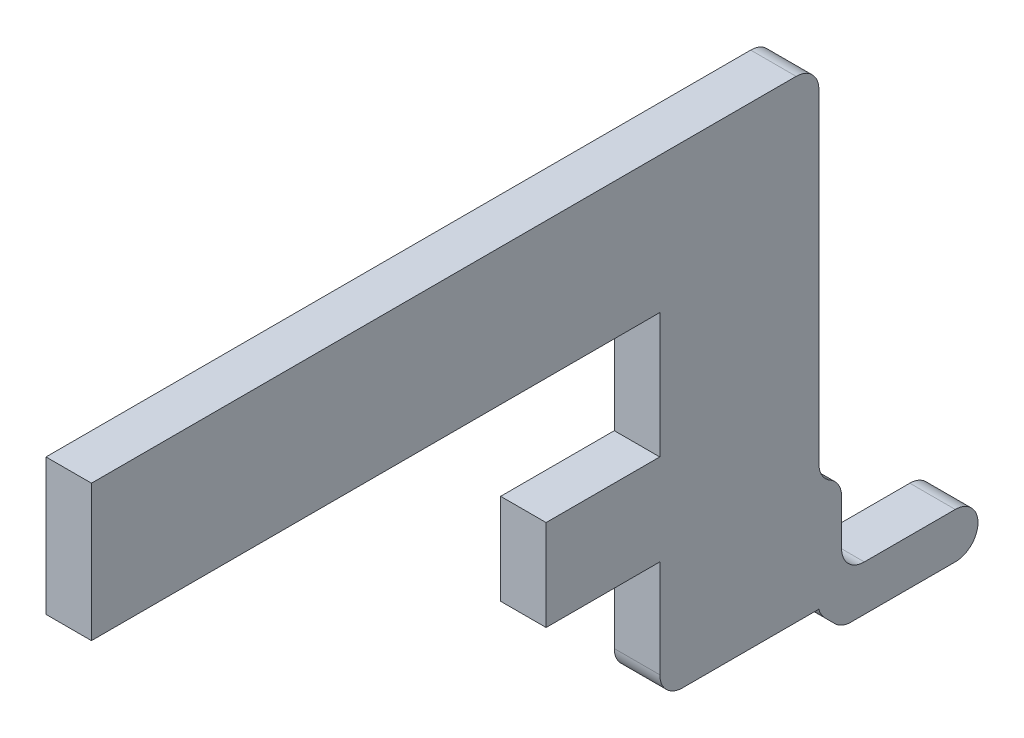
ISO-10303-21;
HEADER;
FILE_DESCRIPTION(('STEP AP214'),'2;1');
FILE_NAME('part.step','',(''),(''),'','','');
FILE_SCHEMA(('AUTOMOTIVE_DESIGN { 1 0 10303 214 1 1 1 1 }'));
ENDSEC;
DATA;
#1=APPLICATION_CONTEXT('core data for automotive mechanical design processes');
#2=APPLICATION_PROTOCOL_DEFINITION('international standard','automotive_design',2000,#1);
#3=PRODUCT_CONTEXT('',#1,'mechanical');
#4=PRODUCT('Part','Part','',(#3));
#5=PRODUCT_RELATED_PRODUCT_CATEGORY('part','',(#4));
#6=PRODUCT_DEFINITION_FORMATION('','',#4);
#7=PRODUCT_DEFINITION_CONTEXT('part definition',#1,'design');
#8=PRODUCT_DEFINITION('design','',#6,#7);
#9=PRODUCT_DEFINITION_SHAPE('','',#8);
#10=(LENGTH_UNIT() NAMED_UNIT(*) SI_UNIT(.MILLI.,.METRE.));
#11=(NAMED_UNIT(*) PLANE_ANGLE_UNIT() SI_UNIT($,.RADIAN.));
#12=(NAMED_UNIT(*) SI_UNIT($,.STERADIAN.) SOLID_ANGLE_UNIT());
#13=UNCERTAINTY_MEASURE_WITH_UNIT(LENGTH_MEASURE(1.E-05),#10,'distance_accuracy_value','');
#14=(GEOMETRIC_REPRESENTATION_CONTEXT(3) GLOBAL_UNCERTAINTY_ASSIGNED_CONTEXT((#13)) GLOBAL_UNIT_ASSIGNED_CONTEXT((#10,
#11,#12)) REPRESENTATION_CONTEXT('',''));
#15=CARTESIAN_POINT('',(0.,0.,0.));
#16=DIRECTION('',(0.,0.,1.));
#17=DIRECTION('',(1.,0.,0.));
#18=AXIS2_PLACEMENT_3D('',#15,#16,#17);
#19=CARTESIAN_POINT('',(2.6,-0.044,-5.038));
#20=DIRECTION('',(-1.,0.,0.));
#21=DIRECTION('',(0.,0.,1.));
#22=AXIS2_PLACEMENT_3D('',#19,#20,#21);
#23=PLANE('',#22);
#24=DIRECTION('',(0.,0.,-1.));
#25=VECTOR('',#24,1.);
#26=CARTESIAN_POINT('',(2.6,1.6,-3.61));
#27=LINE('',#26,#25);
#28=CARTESIAN_POINT('',(2.6,1.6,-3.56));
#29=VERTEX_POINT('',#28);
#30=CARTESIAN_POINT('',(2.6,1.6,-1.06));
#31=VERTEX_POINT('',#30);
#32=EDGE_CURVE('E205',#29,#31,#27,.F.);
#33=ORIENTED_EDGE('',*,*,#32,.F.);
#34=DIRECTION('',(0.,1.,0.));
#35=VECTOR('',#34,1.);
#36=CARTESIAN_POINT('',(2.6,1.039,-3.56));
#37=LINE('',#36,#35);
#38=CARTESIAN_POINT('',(2.6,1.05,-3.56));
#39=VERTEX_POINT('',#38);
#40=EDGE_CURVE('E220',#39,#29,#37,.T.);
#41=ORIENTED_EDGE('',*,*,#40,.F.);
#42=DIRECTION('',(0.,0.,1.));
#43=VECTOR('',#42,1.);
#44=CARTESIAN_POINT('',(2.6,1.05,-3.05));
#45=LINE('',#44,#43);
#46=CARTESIAN_POINT('',(2.6,1.05,-3.06));
#47=VERTEX_POINT('',#46);
#48=EDGE_CURVE('E234',#47,#39,#45,.F.);
#49=ORIENTED_EDGE('',*,*,#48,.F.);
#50=DIRECTION('',(0.,1.,0.));
#51=VECTOR('',#50,1.);
#52=CARTESIAN_POINT('',(2.6,0.642,-3.06));
#53=LINE('',#52,#51);
#54=CARTESIAN_POINT('',(2.6,0.65,-3.06));
#55=VERTEX_POINT('',#54);
#56=EDGE_CURVE('E248',#55,#47,#53,.T.);
#57=ORIENTED_EDGE('',*,*,#56,.F.);
#58=DIRECTION('',(0.,0.,-1.));
#59=VECTOR('',#58,1.);
#60=CARTESIAN_POINT('',(2.6,0.65,-3.57));
#61=LINE('',#60,#59);
#62=CARTESIAN_POINT('',(2.6,0.65,-3.56));
#63=VERTEX_POINT('',#62);
#64=EDGE_CURVE('E262',#63,#55,#61,.F.);
#65=ORIENTED_EDGE('',*,*,#64,.F.);
#66=DIRECTION('',(0.,1.,0.));
#67=VECTOR('',#66,1.);
#68=CARTESIAN_POINT('',(2.6,0.2114,-3.56));
#69=LINE('',#68,#67);
#70=CARTESIAN_POINT('',(2.6,0.22,-3.56));
#71=VERTEX_POINT('',#70);
#72=EDGE_CURVE('E269',#71,#63,#69,.T.);
#73=ORIENTED_EDGE('',*,*,#72,.F.);
#74=CARTESIAN_POINT('',(2.6,0.22,-3.66));
#75=DIRECTION('',(1.,0.,0.));
#76=DIRECTION('',(0.,0.,-1.));
#77=AXIS2_PLACEMENT_3D('',#74,#75,#76);
#78=CIRCLE('',#77,0.1);
#79=CARTESIAN_POINT('',(2.6,0.12,-3.66));
#80=VERTEX_POINT('',#79);
#81=EDGE_CURVE('E328',#80,#71,#78,.F.);
#82=ORIENTED_EDGE('',*,*,#81,.F.);
#83=DIRECTION('',(0.,0.,1.));
#84=VECTOR('',#83,1.);
#85=CARTESIAN_POINT('',(2.6,0.12,-3.648));
#86=LINE('',#85,#84);
#87=CARTESIAN_POINT('',(2.6,0.12,-4.26000000000019));
#88=VERTEX_POINT('',#87);
#89=EDGE_CURVE('E274',#80,#88,#86,.F.);
#90=ORIENTED_EDGE('',*,*,#89,.T.);
#91=CARTESIAN_POINT('',(2.6,0.14445859456,-4.356962761678));
#92=DIRECTION('',(1.,0.,0.));
#93=DIRECTION('',(0.,0.,-1.));
#94=AXIS2_PLACEMENT_3D('',#91,#92,#93);
#95=CIRCLE('',#94,0.1);
#96=CARTESIAN_POINT('',(2.6,0.0737479164409623,-4.28625208355938));
#97=VERTEX_POINT('',#96);
#98=EDGE_CURVE('E277',#97,#88,#95,.F.);
#99=ORIENTED_EDGE('',*,*,#98,.F.);
#100=DIRECTION('',(0.,-0.707106781184048,-0.707106781189048));
#101=VECTOR('',#100,1.);
#102=CARTESIAN_POINT('',(2.6,0.02548606012333,-4.334513939877));
#103=LINE('',#102,#101);
#104=CARTESIAN_POINT('',(2.6,0.0292893218813691,-4.33071067811893));
#105=VERTEX_POINT('',#104);
#106=EDGE_CURVE('E278',#105,#97,#103,.F.);
#107=ORIENTED_EDGE('',*,*,#106,.F.);
#108=CARTESIAN_POINT('',(2.6,0.1,-4.401421356237));
#109=DIRECTION('',(-1.,0.,0.));
#110=DIRECTION('',(0.,0.,1.));
#111=AXIS2_PLACEMENT_3D('',#108,#109,#110);
#112=CIRCLE('',#111,0.1);
#113=CARTESIAN_POINT('',(2.6,0.,-4.401421356237));
#114=VERTEX_POINT('',#113);
#115=EDGE_CURVE('E285',#114,#105,#112,.T.);
#116=ORIENTED_EDGE('',*,*,#115,.F.);
#117=DIRECTION('',(0.,0.,-1.));
#118=VECTOR('',#117,1.);
#119=CARTESIAN_POINT('',(2.6,0.,-4.869171572875));
#120=LINE('',#119,#118);
#121=CARTESIAN_POINT('',(2.6,0.,-4.86));
#122=VERTEX_POINT('',#121);
#123=EDGE_CURVE('E282',#122,#114,#120,.F.);
#124=ORIENTED_EDGE('',*,*,#123,.F.);
#125=CARTESIAN_POINT('',(2.6,0.1,-4.86));
#126=DIRECTION('',(1.,0.,0.));
#127=DIRECTION('',(0.,0.,-1.));
#128=AXIS2_PLACEMENT_3D('',#125,#126,#127);
#129=CIRCLE('',#128,0.1);
#130=CARTESIAN_POINT('',(2.6,0.2,-4.86));
#131=VERTEX_POINT('',#130);
#132=EDGE_CURVE('E335',#131,#122,#129,.F.);
#133=ORIENTED_EDGE('',*,*,#132,.F.);
#134=DIRECTION('',(0.,0.,1.));
#135=VECTOR('',#134,1.);
#136=CARTESIAN_POINT('',(2.6,0.2,-4.452));
#137=LINE('',#136,#135);
#138=CARTESIAN_POINT('',(2.6,0.2,-4.46));
#139=VERTEX_POINT('',#138);
#140=EDGE_CURVE('E287',#139,#131,#137,.F.);
#141=ORIENTED_EDGE('',*,*,#140,.F.);
#142=CARTESIAN_POINT('',(2.6,0.3,-4.46));
#143=DIRECTION('',(-1.,0.,0.));
#144=DIRECTION('',(0.,0.,1.));
#145=AXIS2_PLACEMENT_3D('',#142,#143,#144);
#146=CIRCLE('',#145,0.1);
#147=CARTESIAN_POINT('',(2.6,0.3,-4.36));
#148=VERTEX_POINT('',#147);
#149=EDGE_CURVE('E293',#139,#148,#146,.T.);
#150=ORIENTED_EDGE('',*,*,#149,.T.);
#151=DIRECTION('',(0.,1.,0.));
#152=VECTOR('',#151,1.);
#153=CARTESIAN_POINT('',(2.6,0.505378624359,-4.36));
#154=LINE('',#153,#152);
#155=CARTESIAN_POINT('',(2.6,0.5,-4.36));
#156=VERTEX_POINT('',#155);
#157=EDGE_CURVE('E291',#156,#148,#154,.F.);
#158=ORIENTED_EDGE('',*,*,#157,.F.);
#159=CARTESIAN_POINT('',(2.6,0.5,-4.26));
#160=DIRECTION('',(1.,0.,0.));
#161=DIRECTION('',(0.,0.,-1.));
#162=AXIS2_PLACEMENT_3D('',#159,#160,#161);
#163=CIRCLE('',#162,0.1);
#164=CARTESIAN_POINT('',(2.6,0.586602540378417,-4.3100000000001));
#165=VERTEX_POINT('',#164);
#166=EDGE_CURVE('E339',#165,#156,#163,.F.);
#167=ORIENTED_EDGE('',*,*,#166,.F.);
#168=CARTESIAN_POINT('',(2.6,0.673205080757,-4.36));
#169=DIRECTION('',(1.,0.,0.));
#170=DIRECTION('',(0.,0.,-1.));
#171=AXIS2_PLACEMENT_3D('',#168,#169,#170);
#172=CIRCLE('',#171,0.1);
#173=CARTESIAN_POINT('',(2.6,0.673205080757,-4.26));
#174=VERTEX_POINT('',#173);
#175=EDGE_CURVE('E178',#165,#174,#172,.F.);
#176=ORIENTED_EDGE('',*,*,#175,.T.);
#177=DIRECTION('',(0.,1.,0.));
#178=VECTOR('',#177,1.);
#179=CARTESIAN_POINT('',(2.6,2.128535898385,-4.26));
#180=LINE('',#179,#178);
#181=CARTESIAN_POINT('',(2.6,2.1,-4.26));
#182=VERTEX_POINT('',#181);
#183=EDGE_CURVE('E175',#182,#174,#180,.F.);
#184=ORIENTED_EDGE('',*,*,#183,.F.);
#185=CARTESIAN_POINT('',(2.6,2.1,-4.16));
#186=DIRECTION('',(1.,0.,0.));
#187=DIRECTION('',(0.,0.,-1.));
#188=AXIS2_PLACEMENT_3D('',#185,#186,#187);
#189=CIRCLE('',#188,0.1);
#190=CARTESIAN_POINT('',(2.6,2.2,-4.16));
#191=VERTEX_POINT('',#190);
#192=EDGE_CURVE('E20',#191,#182,#189,.F.);
#193=ORIENTED_EDGE('',*,*,#192,.F.);
#194=DIRECTION('',(0.,0.,1.));
#195=VECTOR('',#194,1.);
#196=CARTESIAN_POINT('',(2.6,2.2,-0.998));
#197=LINE('',#196,#195);
#198=CARTESIAN_POINT('',(2.6,2.2,-1.06));
#199=VERTEX_POINT('',#198);
#200=EDGE_CURVE('E161',#199,#191,#197,.F.);
#201=ORIENTED_EDGE('',*,*,#200,.F.);
#202=DIRECTION('',(0.,1.,0.));
#203=VECTOR('',#202,1.);
#204=CARTESIAN_POINT('',(2.6,1.588,-1.06));
#205=LINE('',#204,#203);
#206=EDGE_CURVE('E210',#31,#199,#205,.T.);
#207=ORIENTED_EDGE('',*,*,#206,.F.);
#208=EDGE_LOOP('',(#33,#41,#49,#57,#65,#73,#82,#90,#99,#107,#116,#124,#133,#141,#150,#158,#167,
#176,#184,#193,#201,#207));
#209=FACE_BOUND('',#208,.T.);
#210=ADVANCED_FACE('F17',(#209),#23,.F.);
#211=CARTESIAN_POINT('',(2.605378624359,1.588,-1.06));
#212=DIRECTION('',(0.,0.,1.));
#213=DIRECTION('',(1.,0.,0.));
#214=AXIS2_PLACEMENT_3D('',#211,#212,#213);
#215=PLANE('',#214);
#216=ORIENTED_EDGE('',*,*,#206,.T.);
#217=DIRECTION('',(1.,0.,0.));
#218=VECTOR('',#217,1.);
#219=CARTESIAN_POINT('',(2.605378624359,2.2,-1.06));
#220=LINE('',#219,#218);
#221=CARTESIAN_POINT('',(2.4,2.2,-1.06));
#222=VERTEX_POINT('',#221);
#223=EDGE_CURVE('E192',#222,#199,#220,.T.);
#224=ORIENTED_EDGE('',*,*,#223,.F.);
#225=DIRECTION('',(0.,1.,0.));
#226=VECTOR('',#225,1.);
#227=CARTESIAN_POINT('',(2.4,-0.044,-1.06));
#228=LINE('',#227,#226);
#229=CARTESIAN_POINT('',(2.4,1.6,-1.06));
#230=VERTEX_POINT('',#229);
#231=EDGE_CURVE('E196',#230,#222,#228,.T.);
#232=ORIENTED_EDGE('',*,*,#231,.F.);
#233=DIRECTION('',(1.,0.,0.));
#234=VECTOR('',#233,1.);
#235=CARTESIAN_POINT('',(2.605378624359,1.6,-1.06));
#236=LINE('',#235,#234);
#237=EDGE_CURVE('E200',#31,#230,#236,.F.);
#238=ORIENTED_EDGE('',*,*,#237,.F.);
#239=EDGE_LOOP('',(#216,#224,#232,#238));
#240=FACE_BOUND('',#239,.T.);
#241=ADVANCED_FACE('F624',(#240),#215,.T.);
#242=CARTESIAN_POINT('',(2.605378624359,2.2,-0.998));
#243=DIRECTION('',(0.,1.,0.));
#244=DIRECTION('',(0.,0.,1.));
#245=AXIS2_PLACEMENT_3D('',#242,#243,#244);
#246=PLANE('',#245);
#247=DIRECTION('',(0.,0.,1.));
#248=VECTOR('',#247,1.);
#249=CARTESIAN_POINT('',(2.4,2.2,-5.038));
#250=LINE('',#249,#248);
#251=CARTESIAN_POINT('',(2.4,2.2,-4.16));
#252=VERTEX_POINT('',#251);
#253=EDGE_CURVE('E199',#222,#252,#250,.F.);
#254=ORIENTED_EDGE('',*,*,#253,.F.);
#255=ORIENTED_EDGE('',*,*,#223,.T.);
#256=ORIENTED_EDGE('',*,*,#200,.T.);
#257=DIRECTION('',(1.,0.,0.));
#258=VECTOR('',#257,1.);
#259=CARTESIAN_POINT('',(2.4,2.2,-4.16));
#260=LINE('',#259,#258);
#261=EDGE_CURVE('E172',#252,#191,#260,.T.);
#262=ORIENTED_EDGE('',*,*,#261,.F.);
#263=EDGE_LOOP('',(#254,#255,#256,#262));
#264=FACE_BOUND('',#263,.T.);
#265=ADVANCED_FACE('F615',(#264),#246,.T.);
#266=CARTESIAN_POINT('',(2.4,2.1,-4.16));
#267=DIRECTION('',(1.,0.,0.));
#268=DIRECTION('',(0.,0.,-1.));
#269=AXIS2_PLACEMENT_3D('',#266,#267,#268);
#270=CYLINDRICAL_SURFACE('',#269,0.1);
#271=ORIENTED_EDGE('',*,*,#192,.T.);
#272=DIRECTION('',(-1.,0.,0.));
#273=VECTOR('',#272,1.);
#274=CARTESIAN_POINT('',(2.605378624359,2.1,-4.26));
#275=LINE('',#274,#273);
#276=CARTESIAN_POINT('',(2.4,2.1,-4.26));
#277=VERTEX_POINT('',#276);
#278=EDGE_CURVE('E170',#277,#182,#275,.F.);
#279=ORIENTED_EDGE('',*,*,#278,.F.);
#280=CARTESIAN_POINT('',(2.4,2.1,-4.16));
#281=DIRECTION('',(1.,0.,0.));
#282=DIRECTION('',(0.,0.,-1.));
#283=AXIS2_PLACEMENT_3D('',#280,#281,#282);
#284=CIRCLE('',#283,0.1);
#285=EDGE_CURVE('E326',#252,#277,#284,.F.);
#286=ORIENTED_EDGE('',*,*,#285,.F.);
#287=ORIENTED_EDGE('',*,*,#261,.T.);
#288=EDGE_LOOP('',(#271,#279,#286,#287));
#289=FACE_BOUND('',#288,.T.);
#290=ADVANCED_FACE('F167',(#289),#270,.T.);
#291=CARTESIAN_POINT('',(2.605378624359,2.128535898385,-4.26));
#292=DIRECTION('',(0.,0.,-1.));
#293=DIRECTION('',(-1.,0.,0.));
#294=AXIS2_PLACEMENT_3D('',#291,#292,#293);
#295=PLANE('',#294);
#296=ORIENTED_EDGE('',*,*,#278,.T.);
#297=ORIENTED_EDGE('',*,*,#183,.T.);
#298=DIRECTION('',(1.,0.,0.));
#299=VECTOR('',#298,1.);
#300=CARTESIAN_POINT('',(2.4,0.673205080757,-4.26));
#301=LINE('',#300,#299);
#302=CARTESIAN_POINT('',(2.4,0.673205080757,-4.26));
#303=VERTEX_POINT('',#302);
#304=EDGE_CURVE('E181',#174,#303,#301,.F.);
#305=ORIENTED_EDGE('',*,*,#304,.T.);
#306=DIRECTION('',(0.,1.,0.));
#307=VECTOR('',#306,1.);
#308=CARTESIAN_POINT('',(2.4,-0.044,-4.26));
#309=LINE('',#308,#307);
#310=EDGE_CURVE('E185',#277,#303,#309,.F.);
#311=ORIENTED_EDGE('',*,*,#310,.F.);
#312=EDGE_LOOP('',(#296,#297,#305,#311));
#313=FACE_BOUND('',#312,.T.);
#314=ADVANCED_FACE('F183',(#313),#295,.T.);
#315=CARTESIAN_POINT('',(2.4,0.673205080757,-4.36));
#316=DIRECTION('',(1.,0.,0.));
#317=DIRECTION('',(0.,0.,-1.));
#318=AXIS2_PLACEMENT_3D('',#315,#316,#317);
#319=CYLINDRICAL_SURFACE('',#318,0.1);
#320=DIRECTION('',(1.,0.,0.));
#321=VECTOR('',#320,1.);
#322=CARTESIAN_POINT('',(2.4,0.586602540378333,-4.31000000000019));
#323=LINE('',#322,#321);
#324=CARTESIAN_POINT('',(2.4,0.586602540378417,-4.3100000000001));
#325=VERTEX_POINT('',#324);
#326=EDGE_CURVE('E340',#325,#165,#323,.T.);
#327=ORIENTED_EDGE('',*,*,#326,.F.);
#328=CARTESIAN_POINT('',(2.4,0.673205080757,-4.36));
#329=DIRECTION('',(1.,0.,0.));
#330=DIRECTION('',(0.,0.,-1.));
#331=AXIS2_PLACEMENT_3D('',#328,#329,#330);
#332=CIRCLE('',#331,0.1);
#333=EDGE_CURVE('E323',#303,#325,#332,.T.);
#334=ORIENTED_EDGE('',*,*,#333,.F.);
#335=ORIENTED_EDGE('',*,*,#304,.F.);
#336=ORIENTED_EDGE('',*,*,#175,.F.);
#337=EDGE_LOOP('',(#327,#334,#335,#336));
#338=FACE_BOUND('',#337,.T.);
#339=ADVANCED_FACE('F344',(#338),#319,.F.);
#340=CARTESIAN_POINT('',(2.4,0.5,-4.26));
#341=DIRECTION('',(1.,0.,0.));
#342=DIRECTION('',(0.,0.,-1.));
#343=AXIS2_PLACEMENT_3D('',#340,#341,#342);
#344=CYLINDRICAL_SURFACE('',#343,0.1);
#345=ORIENTED_EDGE('',*,*,#326,.T.);
#346=ORIENTED_EDGE('',*,*,#166,.T.);
#347=DIRECTION('',(-1.,0.,0.));
#348=VECTOR('',#347,1.);
#349=CARTESIAN_POINT('',(2.605378624359,0.5,-4.36));
#350=LINE('',#349,#348);
#351=CARTESIAN_POINT('',(2.4,0.5,-4.36));
#352=VERTEX_POINT('',#351);
#353=EDGE_CURVE('E294',#352,#156,#350,.F.);
#354=ORIENTED_EDGE('',*,*,#353,.F.);
#355=CARTESIAN_POINT('',(2.4,0.5,-4.26));
#356=DIRECTION('',(1.,0.,0.));
#357=DIRECTION('',(0.,0.,-1.));
#358=AXIS2_PLACEMENT_3D('',#355,#356,#357);
#359=CIRCLE('',#358,0.1);
#360=EDGE_CURVE('E320',#325,#352,#359,.F.);
#361=ORIENTED_EDGE('',*,*,#360,.F.);
#362=EDGE_LOOP('',(#345,#346,#354,#361));
#363=FACE_BOUND('',#362,.T.);
#364=ADVANCED_FACE('F390',(#363),#344,.T.);
#365=CARTESIAN_POINT('',(2.605378624359,0.505378624359,-4.36));
#366=DIRECTION('',(0.,0.,-1.));
#367=DIRECTION('',(-1.,0.,0.));
#368=AXIS2_PLACEMENT_3D('',#365,#366,#367);
#369=PLANE('',#368);
#370=ORIENTED_EDGE('',*,*,#353,.T.);
#371=ORIENTED_EDGE('',*,*,#157,.T.);
#372=DIRECTION('',(-1.,0.,0.));
#373=VECTOR('',#372,1.);
#374=CARTESIAN_POINT('',(2.6,0.3,-4.36));
#375=LINE('',#374,#373);
#376=CARTESIAN_POINT('',(2.4,0.3,-4.36));
#377=VERTEX_POINT('',#376);
#378=EDGE_CURVE('E338',#148,#377,#375,.T.);
#379=ORIENTED_EDGE('',*,*,#378,.T.);
#380=DIRECTION('',(0.,1.,0.));
#381=VECTOR('',#380,1.);
#382=CARTESIAN_POINT('',(2.4,-0.044,-4.36));
#383=LINE('',#382,#381);
#384=EDGE_CURVE('E319',#352,#377,#383,.F.);
#385=ORIENTED_EDGE('',*,*,#384,.F.);
#386=EDGE_LOOP('',(#370,#371,#379,#385));
#387=FACE_BOUND('',#386,.T.);
#388=ADVANCED_FACE('F385',(#387),#369,.T.);
#389=CARTESIAN_POINT('',(2.6,0.3,-4.46));
#390=DIRECTION('',(-1.,0.,0.));
#391=DIRECTION('',(0.,0.,1.));
#392=AXIS2_PLACEMENT_3D('',#389,#390,#391);
#393=CYLINDRICAL_SURFACE('',#392,0.1);
#394=ORIENTED_EDGE('',*,*,#378,.F.);
#395=ORIENTED_EDGE('',*,*,#149,.F.);
#396=DIRECTION('',(1.,0.,0.));
#397=VECTOR('',#396,1.);
#398=CARTESIAN_POINT('',(2.605378624359,0.2,-4.46));
#399=LINE('',#398,#397);
#400=CARTESIAN_POINT('',(2.4,0.2,-4.46));
#401=VERTEX_POINT('',#400);
#402=EDGE_CURVE('E290',#401,#139,#399,.T.);
#403=ORIENTED_EDGE('',*,*,#402,.F.);
#404=CARTESIAN_POINT('',(2.4,0.3,-4.46));
#405=DIRECTION('',(-1.,0.,0.));
#406=DIRECTION('',(0.,0.,1.));
#407=AXIS2_PLACEMENT_3D('',#404,#405,#406);
#408=CIRCLE('',#407,0.1);
#409=EDGE_CURVE('E316',#377,#401,#408,.F.);
#410=ORIENTED_EDGE('',*,*,#409,.F.);
#411=EDGE_LOOP('',(#394,#395,#403,#410));
#412=FACE_BOUND('',#411,.T.);
#413=ADVANCED_FACE('F394',(#412),#393,.F.);
#414=CARTESIAN_POINT('',(2.605378624359,0.2,-4.452));
#415=DIRECTION('',(0.,1.,0.));
#416=DIRECTION('',(0.,0.,1.));
#417=AXIS2_PLACEMENT_3D('',#414,#415,#416);
#418=PLANE('',#417);
#419=ORIENTED_EDGE('',*,*,#140,.T.);
#420=DIRECTION('',(1.,0.,0.));
#421=VECTOR('',#420,1.);
#422=CARTESIAN_POINT('',(2.4,0.2,-4.86));
#423=LINE('',#422,#421);
#424=CARTESIAN_POINT('',(2.4,0.2,-4.86));
#425=VERTEX_POINT('',#424);
#426=EDGE_CURVE('E289',#425,#131,#423,.T.);
#427=ORIENTED_EDGE('',*,*,#426,.F.);
#428=DIRECTION('',(0.,0.,1.));
#429=VECTOR('',#428,1.);
#430=CARTESIAN_POINT('',(2.4,0.2,-5.038));
#431=LINE('',#430,#429);
#432=EDGE_CURVE('E315',#401,#425,#431,.F.);
#433=ORIENTED_EDGE('',*,*,#432,.F.);
#434=ORIENTED_EDGE('',*,*,#402,.T.);
#435=EDGE_LOOP('',(#419,#427,#433,#434));
#436=FACE_BOUND('',#435,.T.);
#437=ADVANCED_FACE('F557',(#436),#418,.T.);
#438=CARTESIAN_POINT('',(2.4,0.1,-4.86));
#439=DIRECTION('',(1.,0.,0.));
#440=DIRECTION('',(0.,0.,-1.));
#441=AXIS2_PLACEMENT_3D('',#438,#439,#440);
#442=CYLINDRICAL_SURFACE('',#441,0.1);
#443=ORIENTED_EDGE('',*,*,#132,.T.);
#444=DIRECTION('',(1.,0.,0.));
#445=VECTOR('',#444,1.);
#446=CARTESIAN_POINT('',(2.605378624359,0.,-4.86));
#447=LINE('',#446,#445);
#448=CARTESIAN_POINT('',(2.4,0.,-4.86));
#449=VERTEX_POINT('',#448);
#450=EDGE_CURVE('E286',#449,#122,#447,.T.);
#451=ORIENTED_EDGE('',*,*,#450,.F.);
#452=CARTESIAN_POINT('',(2.4,0.1,-4.86));
#453=DIRECTION('',(1.,0.,0.));
#454=DIRECTION('',(0.,0.,-1.));
#455=AXIS2_PLACEMENT_3D('',#452,#453,#454);
#456=CIRCLE('',#455,0.1);
#457=EDGE_CURVE('E312',#425,#449,#456,.F.);
#458=ORIENTED_EDGE('',*,*,#457,.F.);
#459=ORIENTED_EDGE('',*,*,#426,.T.);
#460=EDGE_LOOP('',(#443,#451,#458,#459));
#461=FACE_BOUND('',#460,.T.);
#462=ADVANCED_FACE('F547',(#461),#442,.T.);
#463=CARTESIAN_POINT('',(2.605378624359,0.,-4.869171572875));
#464=DIRECTION('',(0.,-1.,0.));
#465=DIRECTION('',(0.,0.,-1.));
#466=AXIS2_PLACEMENT_3D('',#463,#464,#465);
#467=PLANE('',#466);
#468=DIRECTION('',(-1.,0.,0.));
#469=VECTOR('',#468,1.);
#470=CARTESIAN_POINT('',(2.6,0.,-4.401421356237));
#471=LINE('',#470,#469);
#472=CARTESIAN_POINT('',(2.4,0.,-4.401421356237));
#473=VERTEX_POINT('',#472);
#474=EDGE_CURVE('E334',#473,#114,#471,.F.);
#475=ORIENTED_EDGE('',*,*,#474,.F.);
#476=DIRECTION('',(0.,0.,1.));
#477=VECTOR('',#476,1.);
#478=CARTESIAN_POINT('',(2.4,0.,-5.038));
#479=LINE('',#478,#477);
#480=EDGE_CURVE('E311',#449,#473,#479,.T.);
#481=ORIENTED_EDGE('',*,*,#480,.F.);
#482=ORIENTED_EDGE('',*,*,#450,.T.);
#483=ORIENTED_EDGE('',*,*,#123,.T.);
#484=EDGE_LOOP('',(#475,#481,#482,#483));
#485=FACE_BOUND('',#484,.T.);
#486=ADVANCED_FACE('F537',(#485),#467,.T.);
#487=CARTESIAN_POINT('',(2.6,0.1,-4.401421356237));
#488=DIRECTION('',(-1.,0.,0.));
#489=DIRECTION('',(0.,0.,1.));
#490=AXIS2_PLACEMENT_3D('',#487,#488,#489);
#491=CYLINDRICAL_SURFACE('',#490,0.1);
#492=CARTESIAN_POINT('',(2.4,0.1,-4.401421356237));
#493=DIRECTION('',(-1.,0.,0.));
#494=DIRECTION('',(0.,0.,1.));
#495=AXIS2_PLACEMENT_3D('',#492,#493,#494);
#496=CIRCLE('',#495,0.1);
#497=CARTESIAN_POINT('',(2.4,0.0292893218812325,-4.3307106781191));
#498=VERTEX_POINT('',#497);
#499=EDGE_CURVE('E308',#473,#498,#496,.T.);
#500=ORIENTED_EDGE('',*,*,#499,.F.);
#501=ORIENTED_EDGE('',*,*,#474,.T.);
#502=ORIENTED_EDGE('',*,*,#115,.T.);
#503=DIRECTION('',(1.,0.,0.));
#504=VECTOR('',#503,1.);
#505=CARTESIAN_POINT('',(2.605378624359,0.0292893218813367,-4.33071067811897));
#506=LINE('',#505,#504);
#507=EDGE_CURVE('E281',#498,#105,#506,.T.);
#508=ORIENTED_EDGE('',*,*,#507,.F.);
#509=EDGE_LOOP('',(#500,#501,#502,#508));
#510=FACE_BOUND('',#509,.T.);
#511=ADVANCED_FACE('F527',(#510),#491,.T.);
#512=CARTESIAN_POINT('',(2.605378624359,0.02548606012333,-4.334513939877));
#513=DIRECTION('',(0.,-0.707106781189048,0.707106781184048));
#514=DIRECTION('',(0.,-0.707106781184048,-0.707106781189048));
#515=AXIS2_PLACEMENT_3D('',#512,#513,#514);
#516=PLANE('',#515);
#517=ORIENTED_EDGE('',*,*,#507,.T.);
#518=ORIENTED_EDGE('',*,*,#106,.T.);
#519=DIRECTION('',(1.,0.,0.));
#520=VECTOR('',#519,1.);
#521=CARTESIAN_POINT('',(2.4,0.0737479164411804,-4.28625208355951));
#522=LINE('',#521,#520);
#523=CARTESIAN_POINT('',(2.4,0.0737479164407293,-4.28625208355945));
#524=VERTEX_POINT('',#523);
#525=EDGE_CURVE('E280',#524,#97,#522,.T.);
#526=ORIENTED_EDGE('',*,*,#525,.F.);
#527=DIRECTION('',(0.,0.707106781180981,0.707106781192114));
#528=VECTOR('',#527,1.);
#529=CARTESIAN_POINT('',(2.4,0.02928932188137,-4.330710678119));
#530=LINE('',#529,#528);
#531=EDGE_CURVE('E307',#498,#524,#530,.T.);
#532=ORIENTED_EDGE('',*,*,#531,.F.);
#533=EDGE_LOOP('',(#517,#518,#526,#532));
#534=FACE_BOUND('',#533,.T.);
#535=ADVANCED_FACE('F517',(#534),#516,.T.);
#536=CARTESIAN_POINT('',(2.4,0.14445859456,-4.356962761678));
#537=DIRECTION('',(1.,0.,0.));
#538=DIRECTION('',(0.,0.,-1.));
#539=AXIS2_PLACEMENT_3D('',#536,#537,#538);
#540=CYLINDRICAL_SURFACE('',#539,0.1);
#541=ORIENTED_EDGE('',*,*,#98,.T.);
#542=DIRECTION('',(1.,0.,0.));
#543=VECTOR('',#542,1.);
#544=CARTESIAN_POINT('',(2.605378624359,0.12,-4.26));
#545=LINE('',#544,#543);
#546=CARTESIAN_POINT('',(2.4,0.12,-4.26000000000019));
#547=VERTEX_POINT('',#546);
#548=EDGE_CURVE('E276',#88,#547,#545,.F.);
#549=ORIENTED_EDGE('',*,*,#548,.T.);
#550=CARTESIAN_POINT('',(2.4,0.14445859456,-4.356962761678));
#551=DIRECTION('',(1.,0.,0.));
#552=DIRECTION('',(0.,0.,-1.));
#553=AXIS2_PLACEMENT_3D('',#550,#551,#552);
#554=CIRCLE('',#553,0.1);
#555=EDGE_CURVE('E304',#524,#547,#554,.F.);
#556=ORIENTED_EDGE('',*,*,#555,.F.);
#557=ORIENTED_EDGE('',*,*,#525,.T.);
#558=EDGE_LOOP('',(#541,#549,#556,#557));
#559=FACE_BOUND('',#558,.T.);
#560=ADVANCED_FACE('F507',(#559),#540,.T.);
#561=CARTESIAN_POINT('',(2.605378624359,0.12,-3.648));
#562=DIRECTION('',(0.,1.,0.));
#563=DIRECTION('',(0.,0.,1.));
#564=AXIS2_PLACEMENT_3D('',#561,#562,#563);
#565=PLANE('',#564);
#566=DIRECTION('',(0.,0.,1.));
#567=VECTOR('',#566,1.);
#568=CARTESIAN_POINT('',(2.4,0.12,-5.038));
#569=LINE('',#568,#567);
#570=CARTESIAN_POINT('',(2.4,0.12,-3.66));
#571=VERTEX_POINT('',#570);
#572=EDGE_CURVE('E303',#547,#571,#569,.T.);
#573=ORIENTED_EDGE('',*,*,#572,.F.);
#574=ORIENTED_EDGE('',*,*,#548,.F.);
#575=ORIENTED_EDGE('',*,*,#89,.F.);
#576=DIRECTION('',(1.,0.,0.));
#577=VECTOR('',#576,1.);
#578=CARTESIAN_POINT('',(2.4,0.12,-3.66));
#579=LINE('',#578,#577);
#580=EDGE_CURVE('E330',#571,#80,#579,.T.);
#581=ORIENTED_EDGE('',*,*,#580,.F.);
#582=EDGE_LOOP('',(#573,#574,#575,#581));
#583=FACE_BOUND('',#582,.T.);
#584=ADVANCED_FACE('F497',(#583),#565,.F.);
#585=CARTESIAN_POINT('',(2.4,0.22,-3.66));
#586=DIRECTION('',(1.,0.,0.));
#587=DIRECTION('',(0.,0.,-1.));
#588=AXIS2_PLACEMENT_3D('',#585,#586,#587);
#589=CYLINDRICAL_SURFACE('',#588,0.1);
#590=ORIENTED_EDGE('',*,*,#81,.T.);
#591=DIRECTION('',(1.,0.,0.));
#592=VECTOR('',#591,1.);
#593=CARTESIAN_POINT('',(2.605378624359,0.22,-3.56));
#594=LINE('',#593,#592);
#595=CARTESIAN_POINT('',(2.4,0.22,-3.56));
#596=VERTEX_POINT('',#595);
#597=EDGE_CURVE('E271',#596,#71,#594,.T.);
#598=ORIENTED_EDGE('',*,*,#597,.F.);
#599=CARTESIAN_POINT('',(2.4,0.22,-3.66));
#600=DIRECTION('',(1.,0.,0.));
#601=DIRECTION('',(0.,0.,-1.));
#602=AXIS2_PLACEMENT_3D('',#599,#600,#601);
#603=CIRCLE('',#602,0.1);
#604=EDGE_CURVE('E299',#571,#596,#603,.F.);
#605=ORIENTED_EDGE('',*,*,#604,.F.);
#606=ORIENTED_EDGE('',*,*,#580,.T.);
#607=EDGE_LOOP('',(#590,#598,#605,#606));
#608=FACE_BOUND('',#607,.T.);
#609=ADVANCED_FACE('F488',(#608),#589,.T.);
#610=CARTESIAN_POINT('',(2.605378624359,0.2114,-3.56));
#611=DIRECTION('',(0.,0.,1.));
#612=DIRECTION('',(1.,0.,0.));
#613=AXIS2_PLACEMENT_3D('',#610,#611,#612);
#614=PLANE('',#613);
#615=ORIENTED_EDGE('',*,*,#597,.T.);
#616=ORIENTED_EDGE('',*,*,#72,.T.);
#617=DIRECTION('',(1.,0.,0.));
#618=VECTOR('',#617,1.);
#619=CARTESIAN_POINT('',(2.605378624359,0.65,-3.56));
#620=LINE('',#619,#618);
#621=CARTESIAN_POINT('',(2.4,0.65,-3.56));
#622=VERTEX_POINT('',#621);
#623=EDGE_CURVE('E266',#622,#63,#620,.T.);
#624=ORIENTED_EDGE('',*,*,#623,.F.);
#625=DIRECTION('',(0.,1.,0.));
#626=VECTOR('',#625,1.);
#627=CARTESIAN_POINT('',(2.4,-0.044,-3.56));
#628=LINE('',#627,#626);
#629=EDGE_CURVE('E302',#596,#622,#628,.T.);
#630=ORIENTED_EDGE('',*,*,#629,.F.);
#631=EDGE_LOOP('',(#615,#616,#624,#630));
#632=FACE_BOUND('',#631,.T.);
#633=ADVANCED_FACE('F414',(#632),#614,.T.);
#634=CARTESIAN_POINT('',(2.605378624359,0.65,-3.57));
#635=DIRECTION('',(0.,-1.,0.));
#636=DIRECTION('',(0.,0.,-1.));
#637=AXIS2_PLACEMENT_3D('',#634,#635,#636);
#638=PLANE('',#637);
#639=ORIENTED_EDGE('',*,*,#64,.T.);
#640=DIRECTION('',(1.,0.,0.));
#641=VECTOR('',#640,1.);
#642=CARTESIAN_POINT('',(2.605378624359,0.65,-3.06));
#643=LINE('',#642,#641);
#644=CARTESIAN_POINT('',(2.4,0.65,-3.06));
#645=VERTEX_POINT('',#644);
#646=EDGE_CURVE('E252',#645,#55,#643,.T.);
#647=ORIENTED_EDGE('',*,*,#646,.F.);
#648=DIRECTION('',(0.,0.,1.));
#649=VECTOR('',#648,1.);
#650=CARTESIAN_POINT('',(2.4,0.65,-5.038));
#651=LINE('',#650,#649);
#652=EDGE_CURVE('E257',#622,#645,#651,.T.);
#653=ORIENTED_EDGE('',*,*,#652,.F.);
#654=ORIENTED_EDGE('',*,*,#623,.T.);
#655=EDGE_LOOP('',(#639,#647,#653,#654));
#656=FACE_BOUND('',#655,.T.);
#657=ADVANCED_FACE('F418',(#656),#638,.T.);
#658=CARTESIAN_POINT('',(2.605378624359,0.642,-3.06));
#659=DIRECTION('',(0.,0.,1.));
#660=DIRECTION('',(1.,0.,0.));
#661=AXIS2_PLACEMENT_3D('',#658,#659,#660);
#662=PLANE('',#661);
#663=ORIENTED_EDGE('',*,*,#56,.T.);
#664=DIRECTION('',(1.,0.,0.));
#665=VECTOR('',#664,1.);
#666=CARTESIAN_POINT('',(2.605378624359,1.05,-3.06));
#667=LINE('',#666,#665);
#668=CARTESIAN_POINT('',(2.4,1.05,-3.06));
#669=VERTEX_POINT('',#668);
#670=EDGE_CURVE('E238',#669,#47,#667,.T.);
#671=ORIENTED_EDGE('',*,*,#670,.F.);
#672=DIRECTION('',(0.,1.,0.));
#673=VECTOR('',#672,1.);
#674=CARTESIAN_POINT('',(2.4,-0.044,-3.06));
#675=LINE('',#674,#673);
#676=EDGE_CURVE('E243',#645,#669,#675,.T.);
#677=ORIENTED_EDGE('',*,*,#676,.F.);
#678=ORIENTED_EDGE('',*,*,#646,.T.);
#679=EDGE_LOOP('',(#663,#671,#677,#678));
#680=FACE_BOUND('',#679,.T.);
#681=ADVANCED_FACE('F422',(#680),#662,.T.);
#682=CARTESIAN_POINT('',(2.605378624359,1.05,-3.05));
#683=DIRECTION('',(0.,1.,0.));
#684=DIRECTION('',(0.,0.,1.));
#685=AXIS2_PLACEMENT_3D('',#682,#683,#684);
#686=PLANE('',#685);
#687=ORIENTED_EDGE('',*,*,#48,.T.);
#688=DIRECTION('',(1.,0.,0.));
#689=VECTOR('',#688,1.);
#690=CARTESIAN_POINT('',(2.605378624359,1.05,-3.56));
#691=LINE('',#690,#689);
#692=CARTESIAN_POINT('',(2.4,1.05,-3.56));
#693=VERTEX_POINT('',#692);
#694=EDGE_CURVE('E224',#693,#39,#691,.T.);
#695=ORIENTED_EDGE('',*,*,#694,.F.);
#696=DIRECTION('',(0.,0.,1.));
#697=VECTOR('',#696,1.);
#698=CARTESIAN_POINT('',(2.4,1.05,-5.038));
#699=LINE('',#698,#697);
#700=EDGE_CURVE('E229',#669,#693,#699,.F.);
#701=ORIENTED_EDGE('',*,*,#700,.F.);
#702=ORIENTED_EDGE('',*,*,#670,.T.);
#703=EDGE_LOOP('',(#687,#695,#701,#702));
#704=FACE_BOUND('',#703,.T.);
#705=ADVANCED_FACE('F425',(#704),#686,.T.);
#706=CARTESIAN_POINT('',(2.605378624359,1.039,-3.56));
#707=DIRECTION('',(0.,0.,1.));
#708=DIRECTION('',(1.,0.,0.));
#709=AXIS2_PLACEMENT_3D('',#706,#707,#708);
#710=PLANE('',#709);
#711=ORIENTED_EDGE('',*,*,#40,.T.);
#712=DIRECTION('',(1.,0.,0.));
#713=VECTOR('',#712,1.);
#714=CARTESIAN_POINT('',(2.605378624359,1.6,-3.56));
#715=LINE('',#714,#713);
#716=CARTESIAN_POINT('',(2.4,1.6,-3.56));
#717=VERTEX_POINT('',#716);
#718=EDGE_CURVE('E35',#717,#29,#715,.T.);
#719=ORIENTED_EDGE('',*,*,#718,.F.);
#720=DIRECTION('',(0.,1.,0.));
#721=VECTOR('',#720,1.);
#722=CARTESIAN_POINT('',(2.4,-0.044,-3.56));
#723=LINE('',#722,#721);
#724=EDGE_CURVE('E26',#693,#717,#723,.T.);
#725=ORIENTED_EDGE('',*,*,#724,.F.);
#726=ORIENTED_EDGE('',*,*,#694,.T.);
#727=EDGE_LOOP('',(#711,#719,#725,#726));
#728=FACE_BOUND('',#727,.T.);
#729=ADVANCED_FACE('F428',(#728),#710,.T.);
#730=CARTESIAN_POINT('',(2.605378624359,1.6,-3.61));
#731=DIRECTION('',(0.,-1.,0.));
#732=DIRECTION('',(0.,0.,-1.));
#733=AXIS2_PLACEMENT_3D('',#730,#731,#732);
#734=PLANE('',#733);
#735=ORIENTED_EDGE('',*,*,#32,.T.);
#736=ORIENTED_EDGE('',*,*,#237,.T.);
#737=DIRECTION('',(0.,0.,1.));
#738=VECTOR('',#737,1.);
#739=CARTESIAN_POINT('',(2.4,1.6,-5.038));
#740=LINE('',#739,#738);
#741=EDGE_CURVE('E11',#717,#230,#740,.T.);
#742=ORIENTED_EDGE('',*,*,#741,.F.);
#743=ORIENTED_EDGE('',*,*,#718,.T.);
#744=EDGE_LOOP('',(#735,#736,#742,#743));
#745=FACE_BOUND('',#744,.T.);
#746=ADVANCED_FACE('F430',(#745),#734,.T.);
#747=CARTESIAN_POINT('',(2.4,-0.044,-5.038));
#748=DIRECTION('',(-1.,0.,0.));
#749=DIRECTION('',(0.,0.,1.));
#750=AXIS2_PLACEMENT_3D('',#747,#748,#749);
#751=PLANE('',#750);
#752=ORIENTED_EDGE('',*,*,#724,.T.);
#753=ORIENTED_EDGE('',*,*,#741,.T.);
#754=ORIENTED_EDGE('',*,*,#231,.T.);
#755=ORIENTED_EDGE('',*,*,#253,.T.);
#756=ORIENTED_EDGE('',*,*,#285,.T.);
#757=ORIENTED_EDGE('',*,*,#310,.T.);
#758=ORIENTED_EDGE('',*,*,#333,.T.);
#759=ORIENTED_EDGE('',*,*,#360,.T.);
#760=ORIENTED_EDGE('',*,*,#384,.T.);
#761=ORIENTED_EDGE('',*,*,#409,.T.);
#762=ORIENTED_EDGE('',*,*,#432,.T.);
#763=ORIENTED_EDGE('',*,*,#457,.T.);
#764=ORIENTED_EDGE('',*,*,#480,.T.);
#765=ORIENTED_EDGE('',*,*,#499,.T.);
#766=ORIENTED_EDGE('',*,*,#531,.T.);
#767=ORIENTED_EDGE('',*,*,#555,.T.);
#768=ORIENTED_EDGE('',*,*,#572,.T.);
#769=ORIENTED_EDGE('',*,*,#604,.T.);
#770=ORIENTED_EDGE('',*,*,#629,.T.);
#771=ORIENTED_EDGE('',*,*,#652,.T.);
#772=ORIENTED_EDGE('',*,*,#676,.T.);
#773=ORIENTED_EDGE('',*,*,#700,.T.);
#774=EDGE_LOOP('',(#752,#753,#754,#755,#756,#757,#758,#759,#760,#761,#762,#763,#764,#765,#766,
#767,#768,#769,#770,#771,#772,#773));
#775=FACE_BOUND('',#774,.T.);
#776=ADVANCED_FACE('F347',(#775),#751,.T.);
#777=CLOSED_SHELL('',(#210,#241,#265,#290,#314,#339,#364,#388,#413,#437,#462,#486,#511,#535,
#560,#584,#609,#633,#657,#681,#705,#729,#746,#776));
#778=MANIFOLD_SOLID_BREP('B1',#777);
#779=ADVANCED_BREP_SHAPE_REPRESENTATION('',(#18,#778),#14);
#780=SHAPE_DEFINITION_REPRESENTATION(#9,#779);
ENDSEC;
END-ISO-10303-21;
